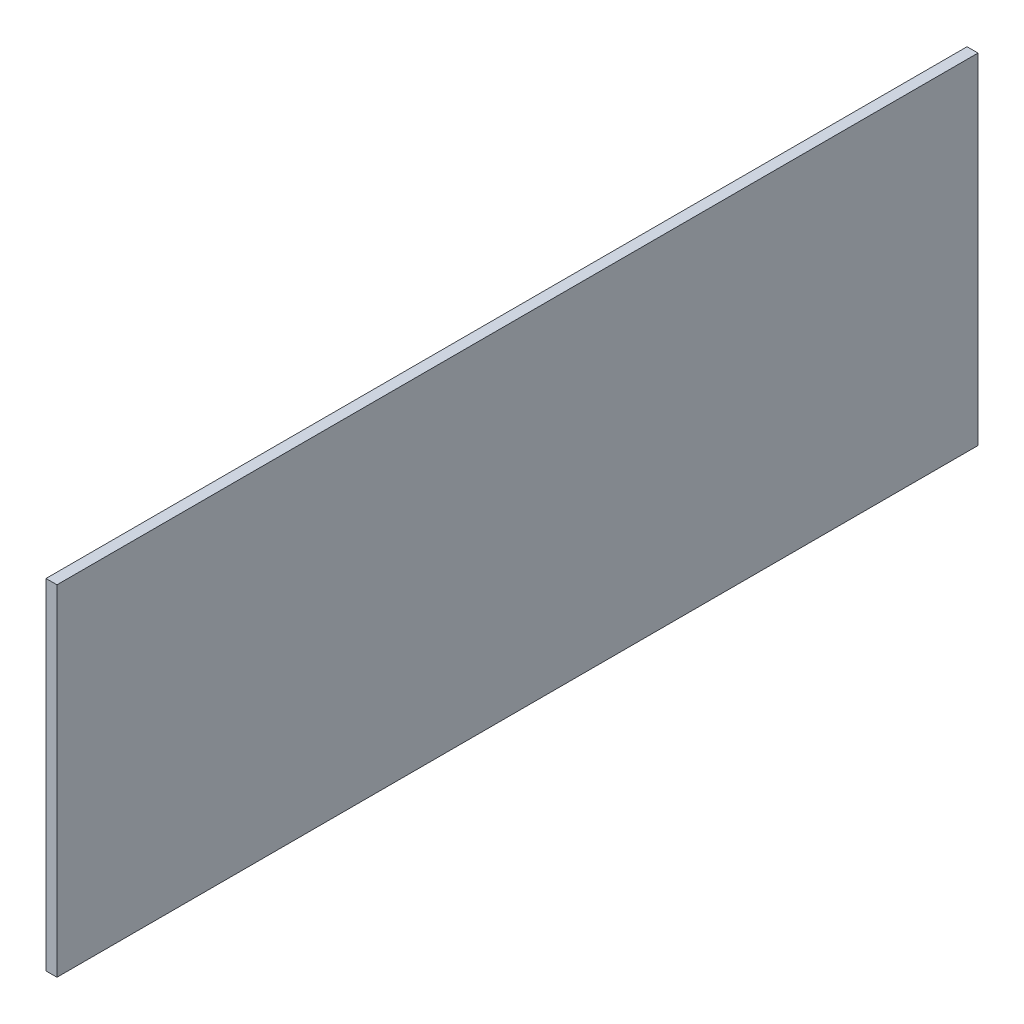
ISO-10303-21;
HEADER;
FILE_DESCRIPTION(('STEP AP214'),'2;1');
FILE_NAME('part.step','',(''),(''),'','','');
FILE_SCHEMA(('AUTOMOTIVE_DESIGN { 1 0 10303 214 1 1 1 1 }'));
ENDSEC;
DATA;
#1=APPLICATION_CONTEXT('core data for automotive mechanical design processes');
#2=APPLICATION_PROTOCOL_DEFINITION('international standard','automotive_design',2000,#1);
#3=PRODUCT_CONTEXT('',#1,'mechanical');
#4=PRODUCT('Part','Part','',(#3));
#5=PRODUCT_RELATED_PRODUCT_CATEGORY('part','',(#4));
#6=PRODUCT_DEFINITION_FORMATION('','',#4);
#7=PRODUCT_DEFINITION_CONTEXT('part definition',#1,'design');
#8=PRODUCT_DEFINITION('design','',#6,#7);
#9=PRODUCT_DEFINITION_SHAPE('','',#8);
#10=(LENGTH_UNIT() NAMED_UNIT(*) SI_UNIT(.MILLI.,.METRE.));
#11=(NAMED_UNIT(*) PLANE_ANGLE_UNIT() SI_UNIT($,.RADIAN.));
#12=(NAMED_UNIT(*) SI_UNIT($,.STERADIAN.) SOLID_ANGLE_UNIT());
#13=UNCERTAINTY_MEASURE_WITH_UNIT(LENGTH_MEASURE(1.E-05),#10,'distance_accuracy_value','');
#14=(GEOMETRIC_REPRESENTATION_CONTEXT(3) GLOBAL_UNCERTAINTY_ASSIGNED_CONTEXT((#13)) GLOBAL_UNIT_ASSIGNED_CONTEXT((#10,
#11,#12)) REPRESENTATION_CONTEXT('',''));
#15=CARTESIAN_POINT('',(0.,0.,0.));
#16=DIRECTION('',(0.,0.,1.));
#17=DIRECTION('',(1.,0.,0.));
#18=AXIS2_PLACEMENT_3D('',#15,#16,#17);
#19=CARTESIAN_POINT('',(25.,0.,0.));
#20=DIRECTION('',(0.,0.,-1.));
#21=DIRECTION('',(-1.,0.,0.));
#22=AXIS2_PLACEMENT_3D('',#19,#20,#21);
#23=PLANE('',#22);
#24=DIRECTION('',(0.,-1.,0.));
#25=VECTOR('',#24,1.);
#26=CARTESIAN_POINT('',(0.,0.,0.));
#27=LINE('',#26,#25);
#28=CARTESIAN_POINT('',(0.,775.,0.));
#29=VERTEX_POINT('',#28);
#30=CARTESIAN_POINT('',(0.,0.,0.));
#31=VERTEX_POINT('',#30);
#32=EDGE_CURVE('E96',#29,#31,#27,.T.);
#33=ORIENTED_EDGE('',*,*,#32,.T.);
#34=DIRECTION('',(-1.,0.,0.));
#35=VECTOR('',#34,1.);
#36=CARTESIAN_POINT('',(25.,0.,0.));
#37=LINE('',#36,#35);
#38=CARTESIAN_POINT('',(25.,0.,0.));
#39=VERTEX_POINT('',#38);
#40=EDGE_CURVE('E11',#39,#31,#37,.T.);
#41=ORIENTED_EDGE('',*,*,#40,.F.);
#42=DIRECTION('',(0.,-1.,0.));
#43=VECTOR('',#42,1.);
#44=CARTESIAN_POINT('',(25.,0.,0.));
#45=LINE('',#44,#43);
#46=CARTESIAN_POINT('',(25.,775.,0.));
#47=VERTEX_POINT('',#46);
#48=EDGE_CURVE('E84',#47,#39,#45,.T.);
#49=ORIENTED_EDGE('',*,*,#48,.F.);
#50=DIRECTION('',(-1.,0.,0.));
#51=VECTOR('',#50,1.);
#52=CARTESIAN_POINT('',(25.,775.,0.));
#53=LINE('',#52,#51);
#54=EDGE_CURVE('E92',#47,#29,#53,.T.);
#55=ORIENTED_EDGE('',*,*,#54,.T.);
#56=EDGE_LOOP('',(#33,#41,#49,#55));
#57=FACE_BOUND('',#56,.T.);
#58=ADVANCED_FACE('F33',(#57),#23,.F.);
#59=CARTESIAN_POINT('',(25.,0.,0.));
#60=DIRECTION('',(0.,1.,0.));
#61=DIRECTION('',(0.,0.,1.));
#62=AXIS2_PLACEMENT_3D('',#59,#60,#61);
#63=PLANE('',#62);
#64=DIRECTION('',(0.,0.,-1.));
#65=VECTOR('',#64,1.);
#66=CARTESIAN_POINT('',(0.,0.,0.));
#67=LINE('',#66,#65);
#68=CARTESIAN_POINT('',(0.,0.,-2100.));
#69=VERTEX_POINT('',#68);
#70=EDGE_CURVE('E88',#31,#69,#67,.T.);
#71=ORIENTED_EDGE('',*,*,#70,.T.);
#72=DIRECTION('',(-1.,0.,0.));
#73=VECTOR('',#72,1.);
#74=CARTESIAN_POINT('',(25.,0.,-2100.));
#75=LINE('',#74,#73);
#76=CARTESIAN_POINT('',(25.,0.,-2100.));
#77=VERTEX_POINT('',#76);
#78=EDGE_CURVE('E41',#77,#69,#75,.T.);
#79=ORIENTED_EDGE('',*,*,#78,.F.);
#80=DIRECTION('',(0.,0.,-1.));
#81=VECTOR('',#80,1.);
#82=CARTESIAN_POINT('',(25.,0.,0.));
#83=LINE('',#82,#81);
#84=EDGE_CURVE('E79',#39,#77,#83,.T.);
#85=ORIENTED_EDGE('',*,*,#84,.F.);
#86=ORIENTED_EDGE('',*,*,#40,.T.);
#87=EDGE_LOOP('',(#71,#79,#85,#86));
#88=FACE_BOUND('',#87,.T.);
#89=ADVANCED_FACE('F87',(#88),#63,.F.);
#90=CARTESIAN_POINT('',(25.,0.,-2100.));
#91=DIRECTION('',(0.,0.,1.));
#92=DIRECTION('',(1.,0.,0.));
#93=AXIS2_PLACEMENT_3D('',#90,#91,#92);
#94=PLANE('',#93);
#95=DIRECTION('',(0.,1.,0.));
#96=VECTOR('',#95,1.);
#97=CARTESIAN_POINT('',(0.,0.,-2100.));
#98=LINE('',#97,#96);
#99=CARTESIAN_POINT('',(0.,775.,-2100.));
#100=VERTEX_POINT('',#99);
#101=EDGE_CURVE('E66',#69,#100,#98,.T.);
#102=ORIENTED_EDGE('',*,*,#101,.T.);
#103=DIRECTION('',(-1.,0.,0.));
#104=VECTOR('',#103,1.);
#105=CARTESIAN_POINT('',(25.,775.,-2100.));
#106=LINE('',#105,#104);
#107=CARTESIAN_POINT('',(25.,775.,-2100.));
#108=VERTEX_POINT('',#107);
#109=EDGE_CURVE('E89',#108,#100,#106,.T.);
#110=ORIENTED_EDGE('',*,*,#109,.F.);
#111=DIRECTION('',(0.,1.,0.));
#112=VECTOR('',#111,1.);
#113=CARTESIAN_POINT('',(25.,0.,-2100.));
#114=LINE('',#113,#112);
#115=EDGE_CURVE('E82',#77,#108,#114,.T.);
#116=ORIENTED_EDGE('',*,*,#115,.F.);
#117=ORIENTED_EDGE('',*,*,#78,.T.);
#118=EDGE_LOOP('',(#102,#110,#116,#117));
#119=FACE_BOUND('',#118,.T.);
#120=ADVANCED_FACE('F90',(#119),#94,.F.);
#121=CARTESIAN_POINT('',(25.,775.,0.));
#122=DIRECTION('',(0.,-1.,0.));
#123=DIRECTION('',(0.,0.,-1.));
#124=AXIS2_PLACEMENT_3D('',#121,#122,#123);
#125=PLANE('',#124);
#126=DIRECTION('',(0.,0.,1.));
#127=VECTOR('',#126,1.);
#128=CARTESIAN_POINT('',(0.,775.,0.));
#129=LINE('',#128,#127);
#130=EDGE_CURVE('E72',#100,#29,#129,.T.);
#131=ORIENTED_EDGE('',*,*,#130,.T.);
#132=ORIENTED_EDGE('',*,*,#54,.F.);
#133=DIRECTION('',(0.,0.,1.));
#134=VECTOR('',#133,1.);
#135=CARTESIAN_POINT('',(25.,775.,0.));
#136=LINE('',#135,#134);
#137=EDGE_CURVE('E49',#108,#47,#136,.T.);
#138=ORIENTED_EDGE('',*,*,#137,.F.);
#139=ORIENTED_EDGE('',*,*,#109,.T.);
#140=EDGE_LOOP('',(#131,#132,#138,#139));
#141=FACE_BOUND('',#140,.T.);
#142=ADVANCED_FACE('F103',(#141),#125,.F.);
#143=CARTESIAN_POINT('',(25.,0.,0.));
#144=DIRECTION('',(-1.,0.,0.));
#145=DIRECTION('',(0.,0.,1.));
#146=AXIS2_PLACEMENT_3D('',#143,#144,#145);
#147=PLANE('',#146);
#148=ORIENTED_EDGE('',*,*,#48,.T.);
#149=ORIENTED_EDGE('',*,*,#84,.T.);
#150=ORIENTED_EDGE('',*,*,#115,.T.);
#151=ORIENTED_EDGE('',*,*,#137,.T.);
#152=EDGE_LOOP('',(#148,#149,#150,#151));
#153=FACE_BOUND('',#152,.T.);
#154=ADVANCED_FACE('F80',(#153),#147,.F.);
#155=CARTESIAN_POINT('',(0.,0.,0.));
#156=DIRECTION('',(-1.,0.,0.));
#157=DIRECTION('',(0.,0.,1.));
#158=AXIS2_PLACEMENT_3D('',#155,#156,#157);
#159=PLANE('',#158);
#160=ORIENTED_EDGE('',*,*,#32,.F.);
#161=ORIENTED_EDGE('',*,*,#130,.F.);
#162=ORIENTED_EDGE('',*,*,#101,.F.);
#163=ORIENTED_EDGE('',*,*,#70,.F.);
#164=EDGE_LOOP('',(#160,#161,#162,#163));
#165=FACE_BOUND('',#164,.T.);
#166=ADVANCED_FACE('F106',(#165),#159,.T.);
#167=CLOSED_SHELL('',(#58,#89,#120,#142,#154,#166));
#168=MANIFOLD_SOLID_BREP('B2',#167);
#169=ADVANCED_BREP_SHAPE_REPRESENTATION('',(#18,#168),#14);
#170=SHAPE_DEFINITION_REPRESENTATION(#9,#169);
ENDSEC;
END-ISO-10303-21;
